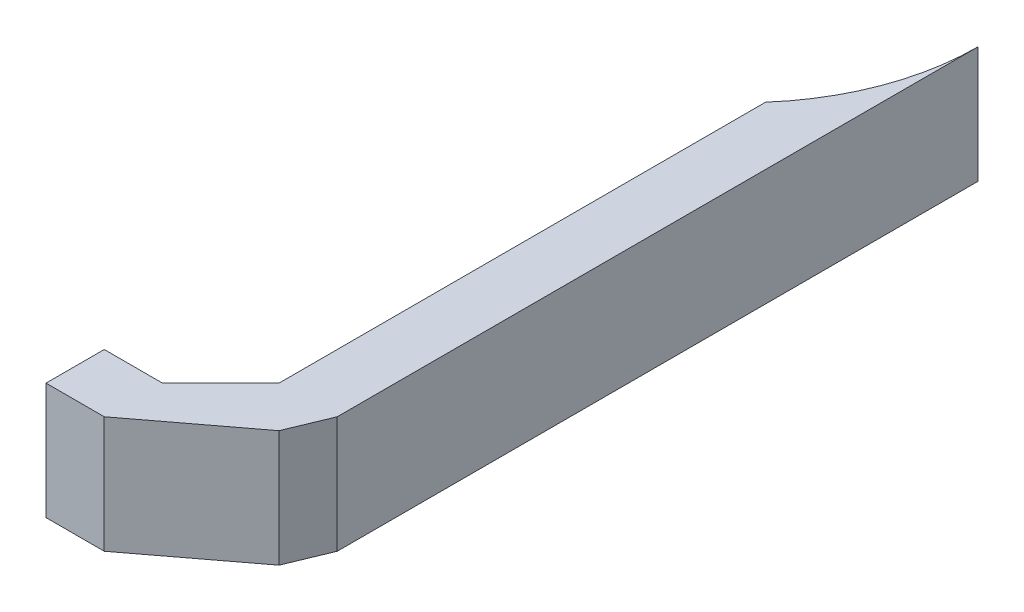
ISO-10303-21;
HEADER;
FILE_DESCRIPTION(('STEP AP214'),'2;1');
FILE_NAME('part.step','',(''),(''),'','','');
FILE_SCHEMA(('AUTOMOTIVE_DESIGN { 1 0 10303 214 1 1 1 1 }'));
ENDSEC;
DATA;
#1=APPLICATION_CONTEXT('core data for automotive mechanical design processes');
#2=APPLICATION_PROTOCOL_DEFINITION('international standard','automotive_design',2000,#1);
#3=PRODUCT_CONTEXT('',#1,'mechanical');
#4=PRODUCT('Part','Part','',(#3));
#5=PRODUCT_RELATED_PRODUCT_CATEGORY('part','',(#4));
#6=PRODUCT_DEFINITION_FORMATION('','',#4);
#7=PRODUCT_DEFINITION_CONTEXT('part definition',#1,'design');
#8=PRODUCT_DEFINITION('design','',#6,#7);
#9=PRODUCT_DEFINITION_SHAPE('','',#8);
#10=(LENGTH_UNIT() NAMED_UNIT(*) SI_UNIT(.MILLI.,.METRE.));
#11=(NAMED_UNIT(*) PLANE_ANGLE_UNIT() SI_UNIT($,.RADIAN.));
#12=(NAMED_UNIT(*) SI_UNIT($,.STERADIAN.) SOLID_ANGLE_UNIT());
#13=UNCERTAINTY_MEASURE_WITH_UNIT(LENGTH_MEASURE(1.E-05),#10,'distance_accuracy_value','');
#14=(GEOMETRIC_REPRESENTATION_CONTEXT(3) GLOBAL_UNCERTAINTY_ASSIGNED_CONTEXT((#13)) GLOBAL_UNIT_ASSIGNED_CONTEXT((#10,
#11,#12)) REPRESENTATION_CONTEXT('',''));
#15=CARTESIAN_POINT('',(0.,0.,0.));
#16=DIRECTION('',(0.,0.,1.));
#17=DIRECTION('',(1.,0.,0.));
#18=AXIS2_PLACEMENT_3D('',#15,#16,#17);
#19=CARTESIAN_POINT('',(0.,10.,0.));
#20=DIRECTION('',(1.,0.,0.));
#21=DIRECTION('',(0.,0.,-1.));
#22=AXIS2_PLACEMENT_3D('',#19,#20,#21);
#23=PLANE('',#22);
#24=DIRECTION('',(0.,0.,1.));
#25=VECTOR('',#24,1.);
#26=CARTESIAN_POINT('',(0.,0.,0.));
#27=LINE('',#26,#25);
#28=CARTESIAN_POINT('',(0.,0.,-5.));
#29=VERTEX_POINT('',#28);
#30=CARTESIAN_POINT('',(0.,0.,0.));
#31=VERTEX_POINT('',#30);
#32=EDGE_CURVE('E145',#29,#31,#27,.T.);
#33=ORIENTED_EDGE('',*,*,#32,.T.);
#34=DIRECTION('',(0.,-1.,0.));
#35=VECTOR('',#34,1.);
#36=CARTESIAN_POINT('',(0.,10.,0.));
#37=LINE('',#36,#35);
#38=CARTESIAN_POINT('',(0.,10.,0.));
#39=VERTEX_POINT('',#38);
#40=EDGE_CURVE('E11',#39,#31,#37,.T.);
#41=ORIENTED_EDGE('',*,*,#40,.F.);
#42=DIRECTION('',(0.,0.,1.));
#43=VECTOR('',#42,1.);
#44=CARTESIAN_POINT('',(0.,10.,0.));
#45=LINE('',#44,#43);
#46=CARTESIAN_POINT('',(0.,10.,-5.));
#47=VERTEX_POINT('',#46);
#48=EDGE_CURVE('E171',#47,#39,#45,.T.);
#49=ORIENTED_EDGE('',*,*,#48,.F.);
#50=DIRECTION('',(0.,-1.,0.));
#51=VECTOR('',#50,1.);
#52=CARTESIAN_POINT('',(0.,10.,-5.));
#53=LINE('',#52,#51);
#54=EDGE_CURVE('E141',#47,#29,#53,.T.);
#55=ORIENTED_EDGE('',*,*,#54,.T.);
#56=EDGE_LOOP('',(#33,#41,#49,#55));
#57=FACE_BOUND('',#56,.T.);
#58=ADVANCED_FACE('F39',(#57),#23,.F.);
#59=CARTESIAN_POINT('',(0.,10.,0.));
#60=DIRECTION('',(0.,0.,-1.));
#61=DIRECTION('',(-1.,0.,0.));
#62=AXIS2_PLACEMENT_3D('',#59,#60,#61);
#63=PLANE('',#62);
#64=DIRECTION('',(1.,0.,0.));
#65=VECTOR('',#64,1.);
#66=CARTESIAN_POINT('',(0.,0.,0.));
#67=LINE('',#66,#65);
#68=CARTESIAN_POINT('',(5.,0.,0.));
#69=VERTEX_POINT('',#68);
#70=EDGE_CURVE('E149',#31,#69,#67,.T.);
#71=ORIENTED_EDGE('',*,*,#70,.T.);
#72=DIRECTION('',(0.,-1.,0.));
#73=VECTOR('',#72,1.);
#74=CARTESIAN_POINT('',(5.,10.,0.));
#75=LINE('',#74,#73);
#76=CARTESIAN_POINT('',(5.,10.,0.));
#77=VERTEX_POINT('',#76);
#78=EDGE_CURVE('E48',#77,#69,#75,.T.);
#79=ORIENTED_EDGE('',*,*,#78,.F.);
#80=DIRECTION('',(1.,0.,0.));
#81=VECTOR('',#80,1.);
#82=CARTESIAN_POINT('',(0.,10.,0.));
#83=LINE('',#82,#81);
#84=EDGE_CURVE('E102',#39,#77,#83,.T.);
#85=ORIENTED_EDGE('',*,*,#84,.F.);
#86=ORIENTED_EDGE('',*,*,#40,.T.);
#87=EDGE_LOOP('',(#71,#79,#85,#86));
#88=FACE_BOUND('',#87,.T.);
#89=ADVANCED_FACE('F227',(#88),#63,.F.);
#90=CARTESIAN_POINT('',(5.,10.,0.));
#91=DIRECTION('',(-0.603748055220393,0.,-0.797175191421304));
#92=DIRECTION('',(-0.797175191421304,0.,0.603748055220393));
#93=AXIS2_PLACEMENT_3D('',#90,#91,#92);
#94=PLANE('',#93);
#95=DIRECTION('',(0.797175191421304,0.,-0.603748055220393));
#96=VECTOR('',#95,1.);
#97=CARTESIAN_POINT('',(5.,0.,0.));
#98=LINE('',#97,#96);
#99=CARTESIAN_POINT('',(13.5355339059328,0.,-6.46446609406733));
#100=VERTEX_POINT('',#99);
#101=EDGE_CURVE('E152',#69,#100,#98,.T.);
#102=ORIENTED_EDGE('',*,*,#101,.T.);
#103=DIRECTION('',(0.,-1.,0.));
#104=VECTOR('',#103,1.);
#105=CARTESIAN_POINT('',(13.5355339059328,10.,-6.46446609406733));
#106=LINE('',#105,#104);
#107=CARTESIAN_POINT('',(13.5355339059328,10.,-6.46446609406733));
#108=VERTEX_POINT('',#107);
#109=EDGE_CURVE('E186',#108,#100,#106,.T.);
#110=ORIENTED_EDGE('',*,*,#109,.F.);
#111=DIRECTION('',(0.797175191421304,0.,-0.603748055220393));
#112=VECTOR('',#111,1.);
#113=CARTESIAN_POINT('',(5.,10.,0.));
#114=LINE('',#113,#112);
#115=EDGE_CURVE('E196',#77,#108,#114,.T.);
#116=ORIENTED_EDGE('',*,*,#115,.F.);
#117=ORIENTED_EDGE('',*,*,#78,.T.);
#118=EDGE_LOOP('',(#102,#110,#116,#117));
#119=FACE_BOUND('',#118,.T.);
#120=ADVANCED_FACE('F194',(#119),#94,.F.);
#121=CARTESIAN_POINT('',(13.5355339059328,10.,-6.46446609406733));
#122=DIRECTION('',(-0.92387953251129,0.,-0.382683432365082));
#123=DIRECTION('',(-0.382683432365082,0.,0.92387953251129));
#124=AXIS2_PLACEMENT_3D('',#121,#122,#123);
#125=PLANE('',#124);
#126=DIRECTION('',(0.382683432365082,0.,-0.92387953251129));
#127=VECTOR('',#126,1.);
#128=CARTESIAN_POINT('',(13.5355339059328,0.,-6.46446609406733));
#129=LINE('',#128,#127);
#130=CARTESIAN_POINT('',(15.,0.,-10.));
#131=VERTEX_POINT('',#130);
#132=EDGE_CURVE('E155',#100,#131,#129,.T.);
#133=ORIENTED_EDGE('',*,*,#132,.T.);
#134=DIRECTION('',(0.,-1.,0.));
#135=VECTOR('',#134,1.);
#136=CARTESIAN_POINT('',(15.,10.,-10.));
#137=LINE('',#136,#135);
#138=CARTESIAN_POINT('',(15.,10.,-10.));
#139=VERTEX_POINT('',#138);
#140=EDGE_CURVE('E182',#139,#131,#137,.T.);
#141=ORIENTED_EDGE('',*,*,#140,.F.);
#142=DIRECTION('',(0.382683432365082,0.,-0.92387953251129));
#143=VECTOR('',#142,1.);
#144=CARTESIAN_POINT('',(13.5355339059328,10.,-6.46446609406733));
#145=LINE('',#144,#143);
#146=EDGE_CURVE('E213',#108,#139,#145,.T.);
#147=ORIENTED_EDGE('',*,*,#146,.F.);
#148=ORIENTED_EDGE('',*,*,#109,.T.);
#149=EDGE_LOOP('',(#133,#141,#147,#148));
#150=FACE_BOUND('',#149,.T.);
#151=ADVANCED_FACE('F205',(#150),#125,.F.);
#152=CARTESIAN_POINT('',(15.,10.,-10.));
#153=DIRECTION('',(-1.,0.,0.));
#154=DIRECTION('',(0.,0.,1.));
#155=AXIS2_PLACEMENT_3D('',#152,#153,#154);
#156=PLANE('',#155);
#157=DIRECTION('',(0.,0.,-1.));
#158=VECTOR('',#157,1.);
#159=CARTESIAN_POINT('',(15.,0.,-10.));
#160=LINE('',#159,#158);
#161=CARTESIAN_POINT('',(15.,0.,-65.));
#162=VERTEX_POINT('',#161);
#163=EDGE_CURVE('E158',#131,#162,#160,.T.);
#164=ORIENTED_EDGE('',*,*,#163,.T.);
#165=DIRECTION('',(0.,-1.,0.));
#166=VECTOR('',#165,1.);
#167=CARTESIAN_POINT('',(15.,10.,-65.));
#168=LINE('',#167,#166);
#169=CARTESIAN_POINT('',(15.,10.,-65.));
#170=VERTEX_POINT('',#169);
#171=EDGE_CURVE('E178',#170,#162,#168,.T.);
#172=ORIENTED_EDGE('',*,*,#171,.F.);
#173=DIRECTION('',(0.,0.,-1.));
#174=VECTOR('',#173,1.);
#175=CARTESIAN_POINT('',(15.,10.,-10.));
#176=LINE('',#175,#174);
#177=EDGE_CURVE('E211',#139,#170,#176,.T.);
#178=ORIENTED_EDGE('',*,*,#177,.F.);
#179=ORIENTED_EDGE('',*,*,#140,.T.);
#180=EDGE_LOOP('',(#164,#172,#178,#179));
#181=FACE_BOUND('',#180,.T.);
#182=ADVANCED_FACE('F209',(#181),#156,.F.);
#183=CARTESIAN_POINT('',(-5.,10.,-65.));
#184=DIRECTION('',(0.,-1.,0.));
#185=DIRECTION('',(0.,0.,-1.));
#186=AXIS2_PLACEMENT_3D('',#183,#184,#185);
#187=CYLINDRICAL_SURFACE('',#186,20.);
#188=CARTESIAN_POINT('',(-5.,0.,-65.));
#189=DIRECTION('',(0.,-1.,0.));
#190=DIRECTION('',(0.,0.,1.));
#191=AXIS2_PLACEMENT_3D('',#188,#189,#190);
#192=CIRCLE('',#191,20.);
#193=CARTESIAN_POINT('',(9.99999999999999,0.,-51.7712434446771));
#194=VERTEX_POINT('',#193);
#195=EDGE_CURVE('E161',#162,#194,#192,.T.);
#196=ORIENTED_EDGE('',*,*,#195,.T.);
#197=DIRECTION('',(0.,-1.,0.));
#198=VECTOR('',#197,1.);
#199=CARTESIAN_POINT('',(9.99999999999999,10.,-51.7712434446771));
#200=LINE('',#199,#198);
#201=CARTESIAN_POINT('',(9.99999999999999,10.,-51.7712434446771));
#202=VERTEX_POINT('',#201);
#203=EDGE_CURVE('E134',#202,#194,#200,.T.);
#204=ORIENTED_EDGE('',*,*,#203,.F.);
#205=CARTESIAN_POINT('',(-5.,10.,-65.));
#206=DIRECTION('',(0.,-1.,0.));
#207=DIRECTION('',(0.,0.,1.));
#208=AXIS2_PLACEMENT_3D('',#205,#206,#207);
#209=CIRCLE('',#208,20.);
#210=EDGE_CURVE('E124',#170,#202,#209,.T.);
#211=ORIENTED_EDGE('',*,*,#210,.F.);
#212=ORIENTED_EDGE('',*,*,#171,.T.);
#213=EDGE_LOOP('',(#196,#204,#211,#212));
#214=FACE_BOUND('',#213,.T.);
#215=ADVANCED_FACE('F239',(#214),#187,.F.);
#216=CARTESIAN_POINT('',(10.,10.,-10.0000000000001));
#217=DIRECTION('',(1.,0.,0.));
#218=DIRECTION('',(0.,0.,-1.));
#219=AXIS2_PLACEMENT_3D('',#216,#217,#218);
#220=PLANE('',#219);
#221=DIRECTION('',(0.,0.,1.));
#222=VECTOR('',#221,1.);
#223=CARTESIAN_POINT('',(10.,0.,-10.0000000000001));
#224=LINE('',#223,#222);
#225=CARTESIAN_POINT('',(10.,0.,-10.0000000000001));
#226=VERTEX_POINT('',#225);
#227=EDGE_CURVE('E132',#194,#226,#224,.T.);
#228=ORIENTED_EDGE('',*,*,#227,.T.);
#229=DIRECTION('',(0.,-1.,0.));
#230=VECTOR('',#229,1.);
#231=CARTESIAN_POINT('',(10.,10.,-10.0000000000001));
#232=LINE('',#231,#230);
#233=CARTESIAN_POINT('',(10.,10.,-10.0000000000001));
#234=VERTEX_POINT('',#233);
#235=EDGE_CURVE('E130',#234,#226,#232,.T.);
#236=ORIENTED_EDGE('',*,*,#235,.F.);
#237=DIRECTION('',(0.,0.,1.));
#238=VECTOR('',#237,1.);
#239=CARTESIAN_POINT('',(9.99999999999999,10.,-20.));
#240=LINE('',#239,#238);
#241=EDGE_CURVE('E118',#202,#234,#240,.T.);
#242=ORIENTED_EDGE('',*,*,#241,.F.);
#243=ORIENTED_EDGE('',*,*,#203,.T.);
#244=EDGE_LOOP('',(#228,#236,#242,#243));
#245=FACE_BOUND('',#244,.T.);
#246=ADVANCED_FACE('F131',(#245),#220,.F.);
#247=CARTESIAN_POINT('',(5.,10.,-5.));
#248=DIRECTION('',(0.707106781186557,0.,0.707106781186538));
#249=DIRECTION('',(0.707106781186538,0.,-0.707106781186557));
#250=AXIS2_PLACEMENT_3D('',#247,#248,#249);
#251=PLANE('',#250);
#252=DIRECTION('',(-0.707106781186538,0.,0.707106781186557));
#253=VECTOR('',#252,1.);
#254=CARTESIAN_POINT('',(5.,0.,-5.));
#255=LINE('',#254,#253);
#256=CARTESIAN_POINT('',(5.,0.,-5.));
#257=VERTEX_POINT('',#256);
#258=EDGE_CURVE('E88',#226,#257,#255,.T.);
#259=ORIENTED_EDGE('',*,*,#258,.T.);
#260=DIRECTION('',(0.,-1.,0.));
#261=VECTOR('',#260,1.);
#262=CARTESIAN_POINT('',(5.,10.,-5.));
#263=LINE('',#262,#261);
#264=CARTESIAN_POINT('',(5.,10.,-5.));
#265=VERTEX_POINT('',#264);
#266=EDGE_CURVE('E135',#265,#257,#263,.T.);
#267=ORIENTED_EDGE('',*,*,#266,.F.);
#268=DIRECTION('',(-0.707106781186538,0.,0.707106781186557));
#269=VECTOR('',#268,1.);
#270=CARTESIAN_POINT('',(5.,10.,-5.));
#271=LINE('',#270,#269);
#272=EDGE_CURVE('E122',#234,#265,#271,.T.);
#273=ORIENTED_EDGE('',*,*,#272,.F.);
#274=ORIENTED_EDGE('',*,*,#235,.T.);
#275=EDGE_LOOP('',(#259,#267,#273,#274));
#276=FACE_BOUND('',#275,.T.);
#277=ADVANCED_FACE('F137',(#276),#251,.F.);
#278=CARTESIAN_POINT('',(0.,10.,-5.));
#279=DIRECTION('',(0.,0.,1.));
#280=DIRECTION('',(1.,0.,0.));
#281=AXIS2_PLACEMENT_3D('',#278,#279,#280);
#282=PLANE('',#281);
#283=DIRECTION('',(-1.,0.,0.));
#284=VECTOR('',#283,1.);
#285=CARTESIAN_POINT('',(0.,0.,-5.));
#286=LINE('',#285,#284);
#287=EDGE_CURVE('E94',#257,#29,#286,.T.);
#288=ORIENTED_EDGE('',*,*,#287,.T.);
#289=ORIENTED_EDGE('',*,*,#54,.F.);
#290=DIRECTION('',(-1.,0.,0.));
#291=VECTOR('',#290,1.);
#292=CARTESIAN_POINT('',(0.,10.,-5.));
#293=LINE('',#292,#291);
#294=EDGE_CURVE('E56',#265,#47,#293,.T.);
#295=ORIENTED_EDGE('',*,*,#294,.F.);
#296=ORIENTED_EDGE('',*,*,#266,.T.);
#297=EDGE_LOOP('',(#288,#289,#295,#296));
#298=FACE_BOUND('',#297,.T.);
#299=ADVANCED_FACE('F247',(#298),#282,.F.);
#300=CARTESIAN_POINT('',(-5.,10.,-65.));
#301=DIRECTION('',(0.,1.,0.));
#302=DIRECTION('',(0.,0.,1.));
#303=AXIS2_PLACEMENT_3D('',#300,#301,#302);
#304=PLANE('',#303);
#305=ORIENTED_EDGE('',*,*,#48,.T.);
#306=ORIENTED_EDGE('',*,*,#84,.T.);
#307=ORIENTED_EDGE('',*,*,#115,.T.);
#308=ORIENTED_EDGE('',*,*,#146,.T.);
#309=ORIENTED_EDGE('',*,*,#177,.T.);
#310=ORIENTED_EDGE('',*,*,#210,.T.);
#311=ORIENTED_EDGE('',*,*,#241,.T.);
#312=ORIENTED_EDGE('',*,*,#272,.T.);
#313=ORIENTED_EDGE('',*,*,#294,.T.);
#314=EDGE_LOOP('',(#305,#306,#307,#308,#309,#310,#311,#312,#313));
#315=FACE_BOUND('',#314,.T.);
#316=ADVANCED_FACE('F120',(#315),#304,.T.);
#317=CARTESIAN_POINT('',(-5.,0.,-65.));
#318=DIRECTION('',(0.,1.,0.));
#319=DIRECTION('',(0.,0.,1.));
#320=AXIS2_PLACEMENT_3D('',#317,#318,#319);
#321=PLANE('',#320);
#322=ORIENTED_EDGE('',*,*,#32,.F.);
#323=ORIENTED_EDGE('',*,*,#287,.F.);
#324=ORIENTED_EDGE('',*,*,#258,.F.);
#325=ORIENTED_EDGE('',*,*,#227,.F.);
#326=ORIENTED_EDGE('',*,*,#195,.F.);
#327=ORIENTED_EDGE('',*,*,#163,.F.);
#328=ORIENTED_EDGE('',*,*,#132,.F.);
#329=ORIENTED_EDGE('',*,*,#101,.F.);
#330=ORIENTED_EDGE('',*,*,#70,.F.);
#331=EDGE_LOOP('',(#322,#323,#324,#325,#326,#327,#328,#329,#330));
#332=FACE_BOUND('',#331,.T.);
#333=ADVANCED_FACE('F200',(#332),#321,.F.);
#334=CLOSED_SHELL('',(#58,#89,#120,#151,#182,#215,#246,#277,#299,#316,#333));
#335=MANIFOLD_SOLID_BREP('B2',#334);
#336=ADVANCED_BREP_SHAPE_REPRESENTATION('',(#18,#335),#14);
#337=SHAPE_DEFINITION_REPRESENTATION(#9,#336);
ENDSEC;
END-ISO-10303-21;
